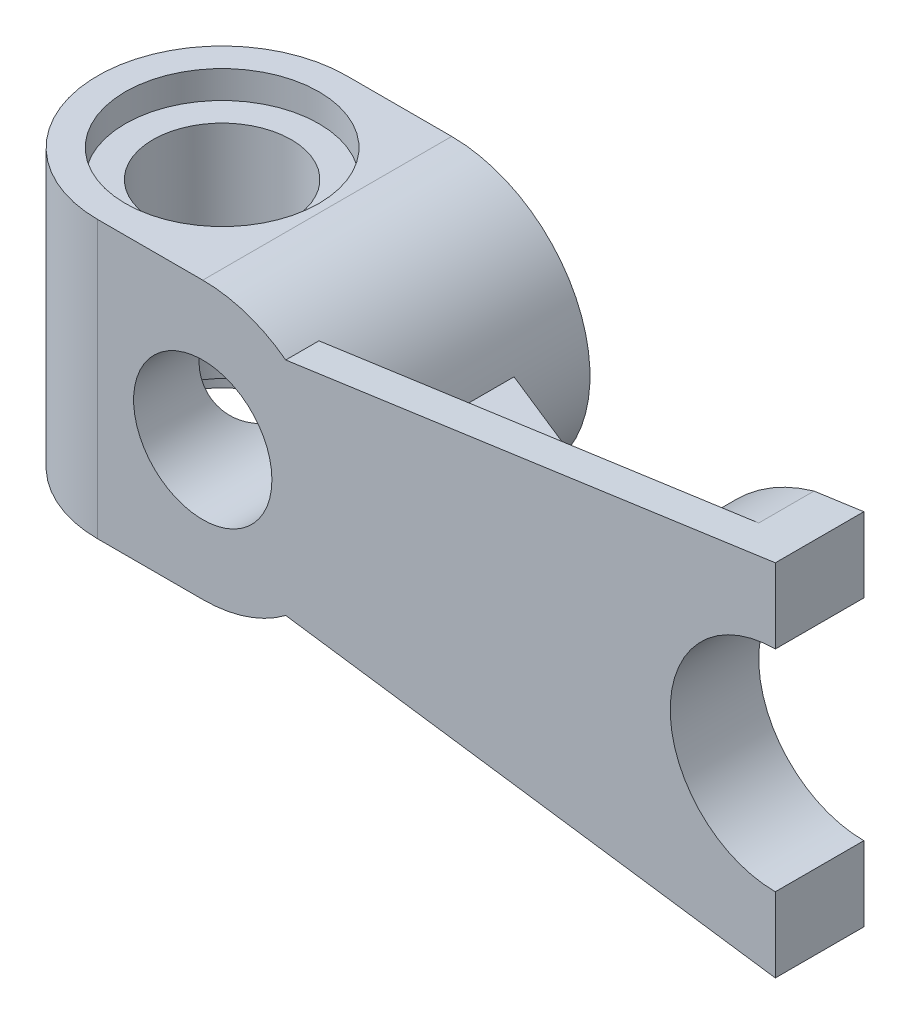
ISO-10303-21;
HEADER;
FILE_DESCRIPTION(('STEP AP214'),'2;1');
FILE_NAME('part.step','',(''),(''),'','','');
FILE_SCHEMA(('AUTOMOTIVE_DESIGN { 1 0 10303 214 1 1 1 1 }'));
ENDSEC;
DATA;
#1=APPLICATION_CONTEXT('core data for automotive mechanical design processes');
#2=APPLICATION_PROTOCOL_DEFINITION('international standard','automotive_design',2000,#1);
#3=PRODUCT_CONTEXT('',#1,'mechanical');
#4=PRODUCT('Part','Part','',(#3));
#5=PRODUCT_RELATED_PRODUCT_CATEGORY('part','',(#4));
#6=PRODUCT_DEFINITION_FORMATION('','',#4);
#7=PRODUCT_DEFINITION_CONTEXT('part definition',#1,'design');
#8=PRODUCT_DEFINITION('design','',#6,#7);
#9=PRODUCT_DEFINITION_SHAPE('','',#8);
#10=(LENGTH_UNIT() NAMED_UNIT(*) SI_UNIT(.MILLI.,.METRE.));
#11=(NAMED_UNIT(*) PLANE_ANGLE_UNIT() SI_UNIT($,.RADIAN.));
#12=(NAMED_UNIT(*) SI_UNIT($,.STERADIAN.) SOLID_ANGLE_UNIT());
#13=UNCERTAINTY_MEASURE_WITH_UNIT(LENGTH_MEASURE(1.E-05),#10,'distance_accuracy_value','');
#14=(GEOMETRIC_REPRESENTATION_CONTEXT(3) GLOBAL_UNCERTAINTY_ASSIGNED_CONTEXT((#13)) GLOBAL_UNIT_ASSIGNED_CONTEXT((#10,
#11,#12)) REPRESENTATION_CONTEXT('',''));
#15=CARTESIAN_POINT('',(0.,0.,0.));
#16=DIRECTION('',(0.,0.,1.));
#17=DIRECTION('',(1.,0.,0.));
#18=AXIS2_PLACEMENT_3D('',#15,#16,#17);
#19=CARTESIAN_POINT('',(-16.928555800193,6.71852058320159,45.));
#20=DIRECTION('',(0.,0.,-1.));
#21=DIRECTION('',(-1.,0.,0.));
#22=AXIS2_PLACEMENT_3D('',#19,#20,#21);
#23=CYLINDRICAL_SURFACE('',#22,25.);
#24=DIRECTION('',(0.,0.,1.));
#25=VECTOR('',#24,1.);
#26=CARTESIAN_POINT('',(7.34076639883021,12.7185205832016,13.));
#27=LINE('',#26,#25);
#28=CARTESIAN_POINT('',(7.34076639883021,12.7185205832016,13.));
#29=VERTEX_POINT('',#28);
#30=CARTESIAN_POINT('',(7.34076639883021,12.7185205832016,39.));
#31=VERTEX_POINT('',#30);
#32=EDGE_CURVE('E299',#29,#31,#27,.T.);
#33=ORIENTED_EDGE('',*,*,#32,.F.);
#34=CARTESIAN_POINT('',(-16.928555800193,6.71852058320159,13.));
#35=DIRECTION('',(0.,0.,1.));
#36=DIRECTION('',(-1.,0.,0.));
#37=AXIS2_PLACEMENT_3D('',#34,#35,#36);
#38=CIRCLE('',#37,25.);
#39=CARTESIAN_POINT('',(7.34076639883021,0.718520583201593,13.));
#40=VERTEX_POINT('',#39);
#41=EDGE_CURVE('E300',#40,#29,#38,.T.);
#42=ORIENTED_EDGE('',*,*,#41,.F.);
#43=DIRECTION('',(0.,0.,1.));
#44=VECTOR('',#43,1.);
#45=CARTESIAN_POINT('',(7.34076639883021,0.718520583201592,13.));
#46=LINE('',#45,#44);
#47=CARTESIAN_POINT('',(7.34076639883021,0.718520583201592,39.));
#48=VERTEX_POINT('',#47);
#49=EDGE_CURVE('E460',#40,#48,#46,.T.);
#50=ORIENTED_EDGE('',*,*,#49,.T.);
#51=CARTESIAN_POINT('',(-16.928555800193,6.71852058320159,39.));
#52=DIRECTION('',(0.,0.,1.));
#53=DIRECTION('',(1.,0.,0.));
#54=AXIS2_PLACEMENT_3D('',#51,#52,#53);
#55=CIRCLE('',#54,25.);
#56=CARTESIAN_POINT('',(-1.92855580019299,-13.2814794167984,39.));
#57=VERTEX_POINT('',#56);
#58=EDGE_CURVE('E218',#57,#48,#55,.T.);
#59=ORIENTED_EDGE('',*,*,#58,.F.);
#60=DIRECTION('',(0.,0.,1.));
#61=VECTOR('',#60,1.);
#62=CARTESIAN_POINT('',(-1.92855580019299,-13.2814794167984,39.));
#63=LINE('',#62,#61);
#64=CARTESIAN_POINT('',(-1.92855580019299,-13.2814794167984,45.));
#65=VERTEX_POINT('',#64);
#66=EDGE_CURVE('E228',#57,#65,#63,.T.);
#67=ORIENTED_EDGE('',*,*,#66,.T.);
#68=CARTESIAN_POINT('',(-16.928555800193,6.71852058320159,45.));
#69=DIRECTION('',(0.,0.,1.));
#70=DIRECTION('',(1.,0.,0.));
#71=AXIS2_PLACEMENT_3D('',#68,#69,#70);
#72=CIRCLE('',#71,25.);
#73=CARTESIAN_POINT('',(-16.928555800193,-18.2814794167984,45.));
#74=VERTEX_POINT('',#73);
#75=EDGE_CURVE('E168',#74,#65,#72,.T.);
#76=ORIENTED_EDGE('',*,*,#75,.F.);
#77=DIRECTION('',(0.,0.,-1.));
#78=VECTOR('',#77,1.);
#79=CARTESIAN_POINT('',(-16.928555800193,-18.2814794167984,45.));
#80=LINE('',#79,#78);
#81=CARTESIAN_POINT('',(-16.928555800193,-18.2814794167984,0.));
#82=VERTEX_POINT('',#81);
#83=EDGE_CURVE('E344',#74,#82,#80,.T.);
#84=ORIENTED_EDGE('',*,*,#83,.T.);
#85=CARTESIAN_POINT('',(-16.928555800193,6.71852058320159,0.));
#86=DIRECTION('',(0.,0.,1.));
#87=DIRECTION('',(1.,0.,0.));
#88=AXIS2_PLACEMENT_3D('',#85,#86,#87);
#89=CIRCLE('',#88,25.);
#90=CARTESIAN_POINT('',(-16.928555800193,31.7185205832016,0.));
#91=VERTEX_POINT('',#90);
#92=EDGE_CURVE('E366',#82,#91,#89,.T.);
#93=ORIENTED_EDGE('',*,*,#92,.T.);
#94=DIRECTION('',(0.,0.,-1.));
#95=VECTOR('',#94,1.);
#96=CARTESIAN_POINT('',(-16.928555800193,31.7185205832016,45.));
#97=LINE('',#96,#95);
#98=CARTESIAN_POINT('',(-16.928555800193,31.7185205832016,45.));
#99=VERTEX_POINT('',#98);
#100=EDGE_CURVE('E341',#99,#91,#97,.T.);
#101=ORIENTED_EDGE('',*,*,#100,.F.);
#102=CARTESIAN_POINT('',(-1.92855580019299,26.7185205832016,45.));
#103=VERTEX_POINT('',#102);
#104=EDGE_CURVE('E357',#103,#99,#72,.T.);
#105=ORIENTED_EDGE('',*,*,#104,.F.);
#106=DIRECTION('',(0.,0.,1.));
#107=VECTOR('',#106,1.);
#108=CARTESIAN_POINT('',(-1.92855580019298,26.7185205832016,39.));
#109=LINE('',#108,#107);
#110=CARTESIAN_POINT('',(-1.92855580019298,26.7185205832016,39.));
#111=VERTEX_POINT('',#110);
#112=EDGE_CURVE('E225',#111,#103,#109,.T.);
#113=ORIENTED_EDGE('',*,*,#112,.F.);
#114=EDGE_CURVE('E217',#31,#111,#55,.T.);
#115=ORIENTED_EDGE('',*,*,#114,.F.);
#116=EDGE_LOOP('',(#33,#42,#50,#59,#67,#76,#84,#93,#101,#105,#113,#115));
#117=FACE_BOUND('',#116,.T.);
#118=ADVANCED_FACE('F41',(#117),#23,.T.);
#119=CARTESIAN_POINT('',(0.,0.,39.));
#120=DIRECTION('',(0.,0.,1.));
#121=DIRECTION('',(1.,0.,0.));
#122=AXIS2_PLACEMENT_3D('',#119,#120,#121);
#123=PLANE('',#122);
#124=DIRECTION('',(1.,0.,0.));
#125=VECTOR('',#124,1.);
#126=CARTESIAN_POINT('',(7.34076639883021,12.7185205832016,39.));
#127=LINE('',#126,#125);
#128=CARTESIAN_POINT('',(54.6300916924381,12.7185205832016,39.));
#129=VERTEX_POINT('',#128);
#130=EDGE_CURVE('E440',#31,#129,#127,.T.);
#131=ORIENTED_EDGE('',*,*,#130,.F.);
#132=ORIENTED_EDGE('',*,*,#114,.T.);
#133=DIRECTION('',(0.990172022130765,0.139854805385701,0.));
#134=VECTOR('',#133,1.);
#135=CARTESIAN_POINT('',(-3.73771048869586,26.4629902599667,39.));
#136=LINE('',#135,#134);
#137=CARTESIAN_POINT('',(77.5702236953318,37.9471617548859,39.));
#138=VERTEX_POINT('',#137);
#139=EDGE_CURVE('E213',#111,#138,#136,.T.);
#140=ORIENTED_EDGE('',*,*,#139,.T.);
#141=CARTESIAN_POINT('',(86.571444199807,6.71852058320159,39.));
#142=DIRECTION('',(0.,0.,1.));
#143=DIRECTION('',(1.,0.,0.));
#144=AXIS2_PLACEMENT_3D('',#141,#142,#143);
#145=CIRCLE('',#144,32.5);
#146=EDGE_CURVE('E209',#138,#129,#145,.T.);
#147=ORIENTED_EDGE('',*,*,#146,.T.);
#148=EDGE_LOOP('',(#131,#132,#140,#147));
#149=FACE_BOUND('',#148,.T.);
#150=ADVANCED_FACE('F287',(#149),#123,.F.);
#151=DIRECTION('',(-1.,0.,0.));
#152=VECTOR('',#151,1.);
#153=CARTESIAN_POINT('',(7.34076639883021,0.718520583201592,39.));
#154=LINE('',#153,#152);
#155=CARTESIAN_POINT('',(54.6300916924381,0.718520583201587,39.));
#156=VERTEX_POINT('',#155);
#157=EDGE_CURVE('E434',#156,#48,#154,.T.);
#158=ORIENTED_EDGE('',*,*,#157,.F.);
#159=CARTESIAN_POINT('',(77.5702236953319,-24.5101205884827,39.));
#160=VERTEX_POINT('',#159);
#161=EDGE_CURVE('E171',#156,#160,#145,.T.);
#162=ORIENTED_EDGE('',*,*,#161,.T.);
#163=DIRECTION('',(0.990172022130765,-0.139854805385701,0.));
#164=VECTOR('',#163,1.);
#165=CARTESIAN_POINT('',(-1.87694478921117,-13.288769107615,39.));
#166=LINE('',#165,#164);
#167=EDGE_CURVE('E222',#57,#160,#166,.T.);
#168=ORIENTED_EDGE('',*,*,#167,.F.);
#169=ORIENTED_EDGE('',*,*,#58,.T.);
#170=EDGE_LOOP('',(#158,#162,#168,#169));
#171=FACE_BOUND('',#170,.T.);
#172=ADVANCED_FACE('F292',(#171),#123,.F.);
#173=CARTESIAN_POINT('',(86.571444199807,6.71852058320159,29.));
#174=DIRECTION('',(0.,0.,1.));
#175=DIRECTION('',(1.,0.,0.));
#176=AXIS2_PLACEMENT_3D('',#173,#174,#175);
#177=CYLINDRICAL_SURFACE('',#176,32.5);
#178=DIRECTION('',(0.,0.,1.));
#179=VECTOR('',#178,1.);
#180=CARTESIAN_POINT('',(77.5702236953318,37.9471617548859,0.));
#181=LINE('',#180,#179);
#182=CARTESIAN_POINT('',(77.5702236953318,37.9471617548859,29.));
#183=VERTEX_POINT('',#182);
#184=EDGE_CURVE('E441',#183,#138,#181,.T.);
#185=ORIENTED_EDGE('',*,*,#184,.F.);
#186=CARTESIAN_POINT('',(86.571444199807,6.71852058320159,29.));
#187=DIRECTION('',(0.,0.,1.));
#188=DIRECTION('',(1.,0.,0.));
#189=AXIS2_PLACEMENT_3D('',#186,#187,#188);
#190=CIRCLE('',#189,32.5);
#191=CARTESIAN_POINT('',(54.6300916924381,12.7185205832016,29.));
#192=VERTEX_POINT('',#191);
#193=EDGE_CURVE('E320',#183,#192,#190,.T.);
#194=ORIENTED_EDGE('',*,*,#193,.T.);
#195=DIRECTION('',(0.,0.,1.));
#196=VECTOR('',#195,1.);
#197=CARTESIAN_POINT('',(54.6300916924381,12.7185205832016,13.));
#198=LINE('',#197,#196);
#199=CARTESIAN_POINT('',(54.6300916924381,12.7185205832016,32.));
#200=VERTEX_POINT('',#199);
#201=EDGE_CURVE('E307',#192,#200,#198,.T.);
#202=ORIENTED_EDGE('',*,*,#201,.T.);
#203=EDGE_CURVE('E312',#200,#129,#198,.T.);
#204=ORIENTED_EDGE('',*,*,#203,.T.);
#205=ORIENTED_EDGE('',*,*,#146,.F.);
#206=EDGE_LOOP('',(#185,#194,#202,#204,#205));
#207=FACE_BOUND('',#206,.T.);
#208=ADVANCED_FACE('F447',(#207),#177,.T.);
#209=DIRECTION('',(0.,0.,1.));
#210=VECTOR('',#209,1.);
#211=CARTESIAN_POINT('',(77.5702236953319,-24.5101205884827,0.));
#212=LINE('',#211,#210);
#213=CARTESIAN_POINT('',(77.5702236953319,-24.5101205884827,29.));
#214=VERTEX_POINT('',#213);
#215=EDGE_CURVE('E56',#214,#160,#212,.T.);
#216=ORIENTED_EDGE('',*,*,#215,.T.);
#217=ORIENTED_EDGE('',*,*,#161,.F.);
#218=DIRECTION('',(0.,0.,1.));
#219=VECTOR('',#218,1.);
#220=CARTESIAN_POINT('',(54.6300916924381,0.718520583201565,13.));
#221=LINE('',#220,#219);
#222=CARTESIAN_POINT('',(54.6300916924381,0.718520583201576,32.));
#223=VERTEX_POINT('',#222);
#224=EDGE_CURVE('E462',#223,#156,#221,.T.);
#225=ORIENTED_EDGE('',*,*,#224,.F.);
#226=CARTESIAN_POINT('',(54.6300916924381,0.718520583201593,29.));
#227=VERTEX_POINT('',#226);
#228=EDGE_CURVE('E63',#227,#223,#221,.T.);
#229=ORIENTED_EDGE('',*,*,#228,.F.);
#230=EDGE_CURVE('E319',#227,#214,#190,.T.);
#231=ORIENTED_EDGE('',*,*,#230,.T.);
#232=EDGE_LOOP('',(#216,#217,#225,#229,#231));
#233=FACE_BOUND('',#232,.T.);
#234=ADVANCED_FACE('F470',(#233),#177,.T.);
#235=CARTESIAN_POINT('',(-16.928555800193,6.71852058320159,45.));
#236=DIRECTION('',(0.,0.,1.));
#237=DIRECTION('',(1.,0.,0.));
#238=AXIS2_PLACEMENT_3D('',#235,#236,#237);
#239=PLANE('',#238);
#240=DIRECTION('',(0.990172022130765,-0.139854805385701,0.));
#241=VECTOR('',#240,1.);
#242=CARTESIAN_POINT('',(-1.87694478921117,-13.288769107615,45.));
#243=LINE('',#242,#241);
#244=CARTESIAN_POINT('',(86.571444199807,-25.7814794167984,45.));
#245=VERTEX_POINT('',#244);
#246=EDGE_CURVE('E160',#65,#245,#243,.T.);
#247=ORIENTED_EDGE('',*,*,#246,.T.);
#248=DIRECTION('',(0.,1.,0.));
#249=VECTOR('',#248,1.);
#250=CARTESIAN_POINT('',(86.571444199807,-12.2814794167984,45.));
#251=LINE('',#250,#249);
#252=CARTESIAN_POINT('',(86.571444199807,-12.2814794167984,45.));
#253=VERTEX_POINT('',#252);
#254=EDGE_CURVE('E166',#245,#253,#251,.T.);
#255=ORIENTED_EDGE('',*,*,#254,.T.);
#256=CARTESIAN_POINT('',(86.571444199807,6.71852058320159,45.));
#257=DIRECTION('',(0.,0.,-1.));
#258=DIRECTION('',(1.,0.,0.));
#259=AXIS2_PLACEMENT_3D('',#256,#257,#258);
#260=CIRCLE('',#259,19.);
#261=CARTESIAN_POINT('',(86.571444199807,25.7185205832016,45.));
#262=VERTEX_POINT('',#261);
#263=EDGE_CURVE('E196',#253,#262,#260,.T.);
#264=ORIENTED_EDGE('',*,*,#263,.T.);
#265=DIRECTION('',(0.,1.,0.));
#266=VECTOR('',#265,1.);
#267=CARTESIAN_POINT('',(86.571444199807,39.2185205832016,45.));
#268=LINE('',#267,#266);
#269=CARTESIAN_POINT('',(86.571444199807,39.2185205832016,45.));
#270=VERTEX_POINT('',#269);
#271=EDGE_CURVE('E188',#262,#270,#268,.T.);
#272=ORIENTED_EDGE('',*,*,#271,.T.);
#273=DIRECTION('',(0.990172022130765,0.139854805385701,0.));
#274=VECTOR('',#273,1.);
#275=CARTESIAN_POINT('',(-3.73771048869586,26.4629902599667,45.));
#276=LINE('',#275,#274);
#277=EDGE_CURVE('E172',#103,#270,#276,.T.);
#278=ORIENTED_EDGE('',*,*,#277,.F.);
#279=ORIENTED_EDGE('',*,*,#104,.T.);
#280=DIRECTION('',(-1.,0.,0.));
#281=VECTOR('',#280,1.);
#282=CARTESIAN_POINT('',(-16.928555800193,31.7185205832016,45.));
#283=LINE('',#282,#281);
#284=CARTESIAN_POINT('',(-35.928555800193,31.7185205832016,45.));
#285=VERTEX_POINT('',#284);
#286=EDGE_CURVE('E377',#99,#285,#283,.T.);
#287=ORIENTED_EDGE('',*,*,#286,.T.);
#288=DIRECTION('',(0.,-1.,0.));
#289=VECTOR('',#288,1.);
#290=CARTESIAN_POINT('',(-35.928555800193,31.7185205832016,45.));
#291=LINE('',#290,#289);
#292=CARTESIAN_POINT('',(-35.928555800193,-18.2814794167984,45.));
#293=VERTEX_POINT('',#292);
#294=EDGE_CURVE('E373',#285,#293,#291,.T.);
#295=ORIENTED_EDGE('',*,*,#294,.T.);
#296=DIRECTION('',(1.,0.,0.));
#297=VECTOR('',#296,1.);
#298=CARTESIAN_POINT('',(-16.928555800193,-18.2814794167984,45.));
#299=LINE('',#298,#297);
#300=EDGE_CURVE('E353',#293,#74,#299,.T.);
#301=ORIENTED_EDGE('',*,*,#300,.T.);
#302=ORIENTED_EDGE('',*,*,#75,.T.);
#303=EDGE_LOOP('',(#247,#255,#264,#272,#278,#279,#287,#295,#301,#302));
#304=FACE_BOUND('',#303,.T.);
#305=CARTESIAN_POINT('',(-16.928555800193,6.71852058320159,45.));
#306=DIRECTION('',(0.,0.,1.));
#307=DIRECTION('',(1.,0.,0.));
#308=AXIS2_PLACEMENT_3D('',#305,#306,#307);
#309=CIRCLE('',#308,12.5);
#310=CARTESIAN_POINT('',(-4.42855580019299,6.71852058320159,45.));
#311=VERTEX_POINT('',#310);
#312=EDGE_CURVE('E370',#311,#311,#309,.T.);
#313=ORIENTED_EDGE('',*,*,#312,.F.);
#314=EDGE_LOOP('',(#313));
#315=FACE_BOUND('',#314,.T.);
#316=ADVANCED_FACE('F162',(#304,#315),#239,.T.);
#317=CARTESIAN_POINT('',(-16.928555800193,6.71852058320159,0.));
#318=DIRECTION('',(0.,0.,1.));
#319=DIRECTION('',(1.,0.,0.));
#320=AXIS2_PLACEMENT_3D('',#317,#318,#319);
#321=PLANE('',#320);
#322=ORIENTED_EDGE('',*,*,#92,.F.);
#323=DIRECTION('',(1.,0.,0.));
#324=VECTOR('',#323,1.);
#325=CARTESIAN_POINT('',(-16.928555800193,-18.2814794167984,0.));
#326=LINE('',#325,#324);
#327=CARTESIAN_POINT('',(-35.928555800193,-18.2814794167984,0.));
#328=VERTEX_POINT('',#327);
#329=EDGE_CURVE('E354',#328,#82,#326,.T.);
#330=ORIENTED_EDGE('',*,*,#329,.F.);
#331=DIRECTION('',(0.,-1.,0.));
#332=VECTOR('',#331,1.);
#333=CARTESIAN_POINT('',(-35.928555800193,31.7185205832016,0.));
#334=LINE('',#333,#332);
#335=CARTESIAN_POINT('',(-35.928555800193,31.7185205832016,0.));
#336=VERTEX_POINT('',#335);
#337=EDGE_CURVE('E358',#336,#328,#334,.T.);
#338=ORIENTED_EDGE('',*,*,#337,.F.);
#339=DIRECTION('',(-1.,0.,0.));
#340=VECTOR('',#339,1.);
#341=CARTESIAN_POINT('',(-16.928555800193,31.7185205832016,0.));
#342=LINE('',#341,#340);
#343=EDGE_CURVE('E362',#91,#336,#342,.T.);
#344=ORIENTED_EDGE('',*,*,#343,.F.);
#345=EDGE_LOOP('',(#322,#330,#338,#344));
#346=FACE_BOUND('',#345,.T.);
#347=CARTESIAN_POINT('',(-16.928555800193,6.71852058320159,0.));
#348=DIRECTION('',(0.,0.,1.));
#349=DIRECTION('',(1.,0.,0.));
#350=AXIS2_PLACEMENT_3D('',#347,#348,#349);
#351=CIRCLE('',#350,12.5);
#352=CARTESIAN_POINT('',(-4.42855580019299,6.71852058320159,0.));
#353=VERTEX_POINT('',#352);
#354=EDGE_CURVE('E383',#353,#353,#351,.T.);
#355=ORIENTED_EDGE('',*,*,#354,.T.);
#356=EDGE_LOOP('',(#355));
#357=FACE_BOUND('',#356,.T.);
#358=ADVANCED_FACE('F422',(#346,#357),#321,.F.);
#359=CARTESIAN_POINT('',(-16.928555800193,31.7185205832016,45.));
#360=DIRECTION('',(0.,-1.,0.));
#361=DIRECTION('',(0.,0.,-1.));
#362=AXIS2_PLACEMENT_3D('',#359,#360,#361);
#363=PLANE('',#362);
#364=CARTESIAN_POINT('',(-35.928555800193,31.7185205832016,22.5));
#365=DIRECTION('',(0.,1.,0.));
#366=DIRECTION('',(0.,0.,1.));
#367=AXIS2_PLACEMENT_3D('',#364,#365,#366);
#368=CIRCLE('',#367,17.5);
#369=CARTESIAN_POINT('',(-35.928555800193,31.7185205832016,40.));
#370=VERTEX_POINT('',#369);
#371=EDGE_CURVE('E398',#370,#370,#368,.T.);
#372=ORIENTED_EDGE('',*,*,#371,.F.);
#373=EDGE_LOOP('',(#372));
#374=FACE_BOUND('',#373,.T.);
#375=ORIENTED_EDGE('',*,*,#343,.T.);
#376=CARTESIAN_POINT('',(-35.928555800193,31.7185205832016,22.5));
#377=DIRECTION('',(0.,1.,0.));
#378=DIRECTION('',(0.,0.,1.));
#379=AXIS2_PLACEMENT_3D('',#376,#377,#378);
#380=CIRCLE('',#379,22.5);
#381=EDGE_CURVE('E391',#336,#285,#380,.T.);
#382=ORIENTED_EDGE('',*,*,#381,.T.);
#383=ORIENTED_EDGE('',*,*,#286,.F.);
#384=ORIENTED_EDGE('',*,*,#100,.T.);
#385=EDGE_LOOP('',(#375,#382,#383,#384));
#386=FACE_BOUND('',#385,.T.);
#387=ADVANCED_FACE('F417',(#374,#386),#363,.F.);
#388=CARTESIAN_POINT('',(-16.928555800193,-18.2814794167984,45.));
#389=DIRECTION('',(0.,1.,0.));
#390=DIRECTION('',(0.,0.,1.));
#391=AXIS2_PLACEMENT_3D('',#388,#389,#390);
#392=PLANE('',#391);
#393=CARTESIAN_POINT('',(-35.928555800193,-18.2814794167984,22.5));
#394=DIRECTION('',(0.,-1.,0.));
#395=DIRECTION('',(0.,0.,-1.));
#396=AXIS2_PLACEMENT_3D('',#393,#394,#395);
#397=CIRCLE('',#396,17.5);
#398=CARTESIAN_POINT('',(-35.928555800193,-18.2814794167984,5.));
#399=VERTEX_POINT('',#398);
#400=EDGE_CURVE('E248',#399,#399,#397,.T.);
#401=ORIENTED_EDGE('',*,*,#400,.F.);
#402=EDGE_LOOP('',(#401));
#403=FACE_BOUND('',#402,.T.);
#404=ORIENTED_EDGE('',*,*,#329,.T.);
#405=ORIENTED_EDGE('',*,*,#83,.F.);
#406=ORIENTED_EDGE('',*,*,#300,.F.);
#407=CARTESIAN_POINT('',(-35.928555800193,-18.2814794167984,22.5));
#408=DIRECTION('',(0.,1.,0.));
#409=DIRECTION('',(0.,0.,1.));
#410=AXIS2_PLACEMENT_3D('',#407,#408,#409);
#411=CIRCLE('',#410,22.5);
#412=EDGE_CURVE('E387',#328,#293,#411,.T.);
#413=ORIENTED_EDGE('',*,*,#412,.F.);
#414=EDGE_LOOP('',(#404,#405,#406,#413));
#415=FACE_BOUND('',#414,.T.);
#416=ADVANCED_FACE('F284',(#403,#415),#392,.F.);
#417=CARTESIAN_POINT('',(-16.928555800193,6.71852058320159,45.));
#418=DIRECTION('',(0.,0.,-1.));
#419=DIRECTION('',(-1.,0.,0.));
#420=AXIS2_PLACEMENT_3D('',#417,#418,#419);
#421=CYLINDRICAL_SURFACE('',#420,12.5);
#422=CARTESIAN_POINT('',(-29.428555800193,6.71852058320159,33.1770782520313));
#423=CARTESIAN_POINT('',(-29.4285548502877,6.43032693334936,33.1770789223446));
#424=CARTESIAN_POINT('',(-29.4185783373116,6.14211542096804,33.1710236357174));
#425=CARTESIAN_POINT('',(-29.3787807814926,5.56748436041855,33.1466419286941));
#426=CARTESIAN_POINT('',(-29.3489522218509,5.28106553251546,33.1283108601671));
#427=CARTESIAN_POINT('',(-29.2697407907815,4.71154735407486,33.0788641828627));
#428=CARTESIAN_POINT('',(-29.2203244960642,4.42845453341833,33.0477267186176));
#429=CARTESIAN_POINT('',(-29.1025861850855,3.86809294641737,32.9719166056268));
#430=CARTESIAN_POINT('',(-29.0342660564707,3.59082360154115,32.9272453082627));
#431=CARTESIAN_POINT('',(-28.879522908939,3.04355084896461,32.8232668279675));
#432=CARTESIAN_POINT('',(-28.793063459202,2.77356331653116,32.7639301478776));
#433=CARTESIAN_POINT('',(-28.6034701665176,2.2435247197862,32.6294924349569));
#434=CARTESIAN_POINT('',(-28.500335890928,1.98347391350782,32.5543909930813));
#435=CARTESIAN_POINT('',(-28.2792844126258,1.47566192009617,32.3872552838004));
#436=CARTESIAN_POINT('',(-28.1613808120284,1.22788971405445,32.2952365607103));
#437=CARTESIAN_POINT('',(-27.9129915960362,0.746458827765566,32.0930367921279));
#438=CARTESIAN_POINT('',(-27.782506774196,0.512799258880513,31.9828568918327));
#439=CARTESIAN_POINT('',(-27.517112766769,0.0704890899466913,31.7481203895829));
#440=CARTESIAN_POINT('',(-27.3825857612119,-0.138786479595706,31.6243095674551));
#441=CARTESIAN_POINT('',(-27.1073377440516,-0.541079695916733,31.3584815863528));
#442=CARTESIAN_POINT('',(-26.9666169030143,-0.734097789967804,31.2164649285248));
#443=CARTESIAN_POINT('',(-26.6821759019789,-1.102673766432,30.9141254483601));
#444=CARTESIAN_POINT('',(-26.5384567209546,-1.27823724318038,30.7538085270132));
#445=CARTESIAN_POINT('',(-26.2512823039307,-1.61125272284681,30.4151525738792));
#446=CARTESIAN_POINT('',(-26.107827056083,-1.7687055592917,30.2368143722167));
#447=CARTESIAN_POINT('',(-25.8344782324781,-2.0547855611648,29.8761192345308));
#448=CARTESIAN_POINT('',(-25.7043421680095,-2.1846629510694,29.6949346295152));
#449=CARTESIAN_POINT('',(-25.4496395802491,-2.42873308199787,29.3186450105255));
#450=CARTESIAN_POINT('',(-25.3250727715653,-2.54292662735005,29.1235407111874));
#451=CARTESIAN_POINT('',(-25.083749827448,-2.75611672317241,28.7205590594081));
#452=CARTESIAN_POINT('',(-24.9669953921585,-2.85510997175405,28.5126789454307));
#453=CARTESIAN_POINT('',(-24.7433029783088,-3.03856196919925,28.0855391832165));
#454=CARTESIAN_POINT('',(-24.636365385396,-3.12302014717732,27.866279088455));
#455=CARTESIAN_POINT('',(-24.4316345218949,-3.28002150089496,27.4126518189928));
#456=CARTESIAN_POINT('',(-24.3341099871998,-3.35224387931349,27.1780525152141));
#457=CARTESIAN_POINT('',(-24.1525314172997,-3.48327911655221,26.7000735721619));
#458=CARTESIAN_POINT('',(-24.0684774816589,-3.54209187626034,26.4566938680069));
#459=CARTESIAN_POINT('',(-23.9149480085212,-3.64723978171544,25.9626801970946));
#460=CARTESIAN_POINT('',(-23.8454764446583,-3.69357152741157,25.7120442741658));
#461=CARTESIAN_POINT('',(-23.721989048836,-3.77455882248088,25.2051418817064));
#462=CARTESIAN_POINT('',(-23.6679739526456,-3.80921381602354,24.9488751447592));
#463=CARTESIAN_POINT('',(-23.5722271776896,-3.86992216418207,24.4109624190643));
#464=CARTESIAN_POINT('',(-23.531872730742,-3.8950325738247,24.1289638413436));
#465=CARTESIAN_POINT('',(-23.4704918030014,-3.93297564410772,23.5620486548426));
#466=CARTESIAN_POINT('',(-23.4494662914122,-3.94580768907986,23.2771319004614));
#467=CARTESIAN_POINT('',(-23.4269891199097,-3.95951949370775,22.706136309739));
#468=CARTESIAN_POINT('',(-23.4255445616292,-3.96039491692914,22.4200570894196));
#469=CARTESIAN_POINT('',(-23.4422641483089,-3.95020455265874,21.8486830049098));
#470=CARTESIAN_POINT('',(-23.4604286329684,-3.93913855829856,21.5633881543933));
#471=CARTESIAN_POINT('',(-23.5174577774621,-3.90398173357756,20.9821607477052));
#472=CARTESIAN_POINT('',(-23.5572495954118,-3.87930672997023,20.6863536702801));
#473=CARTESIAN_POINT('',(-23.6575536551255,-3.81590408441428,20.0997835897839));
#474=CARTESIAN_POINT('',(-23.7180667326178,-3.77717587566901,19.8090207906555));
#475=CARTESIAN_POINT('',(-23.8589331812766,-3.68469835290102,19.234791116958));
#476=CARTESIAN_POINT('',(-23.9392850352381,-3.63095018751425,18.9513236862926));
#477=CARTESIAN_POINT('',(-24.1185558473881,-3.50721916401193,18.3939579449933));
#478=CARTESIAN_POINT('',(-24.2174739948454,-3.43723701475155,18.1200592171436));
#479=CARTESIAN_POINT('',(-24.4295361552515,-3.28158726797251,17.5906329834314));
#480=CARTESIAN_POINT('',(-24.5422786002939,-3.19633961220033,17.3348214694289));
#481=CARTESIAN_POINT('',(-24.7816675327472,-3.00782665749152,16.8366766017897));
#482=CARTESIAN_POINT('',(-24.9083138294246,-2.90456160570642,16.5943430633304));
#483=CARTESIAN_POINT('',(-25.1727673207586,-2.67898639066751,16.1254086542245));
#484=CARTESIAN_POINT('',(-25.3105652912126,-2.55669189205296,15.8987950631246));
#485=CARTESIAN_POINT('',(-25.5942753817494,-2.29218867122137,15.4629373419644));
#486=CARTESIAN_POINT('',(-25.7401867587845,-2.14998177083053,15.2536916256682));
#487=CARTESIAN_POINT('',(-26.0244575412717,-1.85776355001149,14.8703827002177));
#488=CARTESIAN_POINT('',(-26.1624596751779,-1.70933968580536,14.6948417526554));
#489=CARTESIAN_POINT('',(-26.4393766847264,-1.39554448004019,14.3604294814522));
#490=CARTESIAN_POINT('',(-26.5782915065244,-1.23017412999062,14.201557183657));
#491=CARTESIAN_POINT('',(-26.8540491392435,-0.883038972323527,13.9008744922312));
#492=CARTESIAN_POINT('',(-26.9908920521238,-0.701274974524087,13.7590632566201));
#493=CARTESIAN_POINT('',(-27.2596344676923,-0.322272641261422,13.4924674625166));
#494=CARTESIAN_POINT('',(-27.3915339727975,-0.125034313364229,13.3676828956994));
#495=CARTESIAN_POINT('',(-27.6425415544296,0.275379372802375,13.1394669956271));
#496=CARTESIAN_POINT('',(-27.7619513625724,0.477990481002103,13.0353753905542));
#497=CARTESIAN_POINT('',(-27.9917080468298,0.895005176216594,12.8418939588233));
#498=CARTESIAN_POINT('',(-28.1020552303508,1.10940836282904,12.7525036333913));
#499=CARTESIAN_POINT('',(-28.3119538313306,1.54865433033581,12.5876239360692));
#500=CARTESIAN_POINT('',(-28.4115024911166,1.77349975707868,12.5121381116211));
#501=CARTESIAN_POINT('',(-28.5983249110896,2.23211781575949,12.3742308899524));
#502=CARTESIAN_POINT('',(-28.685598054987,2.46589089515967,12.3118101485847));
#503=CARTESIAN_POINT('',(-28.8514985436875,2.95500830894285,12.1958203956442));
#504=CARTESIAN_POINT('',(-28.9293034993946,3.21080884711088,12.142998187549));
#505=CARTESIAN_POINT('',(-29.0687770038554,3.72903135026961,12.0500977407176));
#506=CARTESIAN_POINT('',(-29.1304450491512,3.99145352156964,12.0100198995865));
#507=CARTESIAN_POINT('',(-29.2368986206706,4.52130861902761,11.9417934511641));
#508=CARTESIAN_POINT('',(-29.2816788350608,4.7887430940182,11.9136485968833));
#509=CARTESIAN_POINT('',(-29.3538161497509,5.32689522790386,11.8686971013209));
#510=CARTESIAN_POINT('',(-29.3811725817572,5.59761301232528,11.8518908949344));
#511=CARTESIAN_POINT('',(-29.4195719087093,6.16145089190954,11.8283698231912));
#512=CARTESIAN_POINT('',(-29.4292105884878,6.45470403455927,11.8225229107571));
#513=CARTESIAN_POINT('',(-29.427831824777,7.04115339037647,11.8233627051288));
#514=CARTESIAN_POINT('',(-29.4168133143965,7.33434959982131,11.8300500592974));
#515=CARTESIAN_POINT('',(-29.3742479218116,7.91877404334335,11.8561439013894));
#516=CARTESIAN_POINT('',(-29.3426947949737,8.21000165153428,11.8755542584259));
#517=CARTESIAN_POINT('',(-29.2594548040365,8.78837275492169,11.9276067710544));
#518=CARTESIAN_POINT('',(-29.2077679884226,9.0755162599517,11.9602488947818));
#519=CARTESIAN_POINT('',(-29.0837528178925,9.64921613839796,12.0403523394056));
#520=CARTESIAN_POINT('',(-29.0110403529163,9.93565108152048,12.0880911344793));
#521=CARTESIAN_POINT('',(-28.8465133191509,10.4998742324432,12.1992948872472));
#522=CARTESIAN_POINT('',(-28.7546982951029,10.777662233985,12.2627602197488));
#523=CARTESIAN_POINT('',(-28.5535670983066,11.3221374887435,12.4066944344217));
#524=CARTESIAN_POINT('',(-28.4442595061918,11.5888301041809,12.487154986083));
#525=CARTESIAN_POINT('',(-28.2101749837327,12.1089161585374,12.666469811061));
#526=CARTESIAN_POINT('',(-28.0853992337433,12.3623106101244,12.7653226811719));
#527=CARTESIAN_POINT('',(-27.8299926921681,12.8404641488139,12.9769085363208));
#528=CARTESIAN_POINT('',(-27.7000272130025,13.0660295292722,13.0886224561846));
#529=CARTESIAN_POINT('',(-27.4312797653438,13.5014575938363,13.3305417241281));
#530=CARTESIAN_POINT('',(-27.2924981419942,13.7113208919637,13.460746348561));
#531=CARTESIAN_POINT('',(-27.0093042818992,14.1137228161227,13.7400649126999));
#532=CARTESIAN_POINT('',(-26.8648956041733,14.3062721459801,13.8891670302979));
#533=CARTESIAN_POINT('',(-26.5737560223369,14.6730754843008,14.2063858561484));
#534=CARTESIAN_POINT('',(-26.4270252642811,14.8473306382132,14.3745013725488));
#535=CARTESIAN_POINT('',(-26.1464835577773,15.1636895795929,14.715030294335));
#536=CARTESIAN_POINT('',(-26.0125803870853,15.3072511571018,14.8860171874797));
#537=CARTESIAN_POINT('',(-25.7484643075094,15.5782621419198,15.2429339281553));
#538=CARTESIAN_POINT('',(-25.6182511843367,15.7057124863356,15.4288629055531));
#539=CARTESIAN_POINT('',(-25.3640074171205,15.9447671308165,15.8146654438053));
#540=CARTESIAN_POINT('',(-25.2399779586964,16.056368399598,16.0145416613269));
#541=CARTESIAN_POINT('',(-25.0003895804642,16.2642350592584,16.4269402655854));
#542=CARTESIAN_POINT('',(-24.8848309173066,16.360499985576,16.6394630351378));
#543=CARTESIAN_POINT('',(-24.6638678293545,16.5386606185944,17.0762684312188));
#544=CARTESIAN_POINT('',(-24.5584895567229,16.6205197392559,17.3005791732985));
#545=CARTESIAN_POINT('',(-24.3598557833186,16.7704493172279,17.75894787753));
#546=CARTESIAN_POINT('',(-24.266600208626,16.8385198586174,17.9930057802357));
#547=CARTESIAN_POINT('',(-24.0935059464618,16.9618007330181,18.4693871129866));
#548=CARTESIAN_POINT('',(-24.0136706988727,17.0170077702669,18.7117126430914));
#549=CARTESIAN_POINT('',(-23.8684678379313,17.1154101608437,19.2030444816178));
#550=CARTESIAN_POINT('',(-23.8031009510375,17.1586049110612,19.4520511247954));
#551=CARTESIAN_POINT('',(-23.6830197052296,17.2367316155892,19.9752279177017));
#552=CARTESIAN_POINT('',(-23.6295632544744,17.2707351878944,20.2498262216116));
#553=CARTESIAN_POINT('',(-23.5410845845735,17.3264041073551,20.8032120403497));
#554=CARTESIAN_POINT('',(-23.5060632198265,17.3480688826565,21.0819997487257));
#555=CARTESIAN_POINT('',(-23.4548617532724,17.3795823054209,21.6420627669253));
#556=CARTESIAN_POINT('',(-23.4386884052739,17.3894267173322,21.9233389320827));
#557=CARTESIAN_POINT('',(-23.4253897447458,17.397528293782,22.4865094354787));
#558=CARTESIAN_POINT('',(-23.4282649079893,17.3957851688996,22.7684037889819));
#559=CARTESIAN_POINT('',(-23.453753364991,17.3802299275452,23.3473822951697));
#560=CARTESIAN_POINT('',(-23.4775021872341,17.3657234355641,23.6443988125016));
#561=CARTESIAN_POINT('',(-23.5459875500011,17.3232937979564,24.2350499469589));
#562=CARTESIAN_POINT('',(-23.5907250468184,17.2953700410063,24.5286844093653));
#563=CARTESIAN_POINT('',(-23.7005861437332,17.2253681771803,25.1104372988111));
#564=CARTESIAN_POINT('',(-23.7657114641759,17.1832888758228,25.3985552581846));
#565=CARTESIAN_POINT('',(-23.9153927087801,17.0839522261398,25.9670291509375));
#566=CARTESIAN_POINT('',(-23.9999480746365,17.0266953139219,26.2473853070859));
#567=CARTESIAN_POINT('',(-24.1861965861754,16.8964097262252,26.7953339237912));
#568=CARTESIAN_POINT('',(-24.2877112600036,16.8235432707436,27.0630254665754));
#569=CARTESIAN_POINT('',(-24.5066654659235,16.6603956749826,27.5863403214177));
#570=CARTESIAN_POINT('',(-24.624104989765,16.570114543725,27.8419636397278));
#571=CARTESIAN_POINT('',(-24.8725055395788,16.370928091405,28.3387336508235));
#572=CARTESIAN_POINT('',(-25.00345608902,16.2620371581214,28.5798913342669));
#573=CARTESIAN_POINT('',(-25.2761024908693,16.0244929997374,29.0458445117253));
#574=CARTESIAN_POINT('',(-25.4177973318513,15.8958416336412,29.2706415419743));
#575=CARTESIAN_POINT('',(-25.6975640985605,15.6285721114542,29.6857255426598));
#576=CARTESIAN_POINT('',(-25.8350984467328,15.4914454312729,29.8773367235083));
#577=CARTESIAN_POINT('',(-26.1135268808053,15.1994976437026,30.2439123759415));
#578=CARTESIAN_POINT('',(-26.2544207831481,15.0446775012928,30.4188777544147));
#579=CARTESIAN_POINT('',(-26.5364099545679,14.7176287361905,30.7513706684932));
#580=CARTESIAN_POINT('',(-26.6775051469593,14.5454055687148,30.908903636286));
#581=CARTESIAN_POINT('',(-26.9568139711157,14.184184855751,31.2062894435758));
#582=CARTESIAN_POINT('',(-27.0950276634763,13.9951876634482,31.3461426551784));
#583=CARTESIAN_POINT('',(-27.3577850988929,13.6128549432334,31.6007372232722));
#584=CARTESIAN_POINT('',(-27.4826575560967,13.4203976811551,31.7164614812947));
#585=CARTESIAN_POINT('',(-27.7249210892073,13.0227019567668,31.9327490215999));
#586=CARTESIAN_POINT('',(-27.8423124574442,12.8174639944947,32.0333128964981));
#587=CARTESIAN_POINT('',(-28.0676952846707,12.3953901710625,32.219995353204));
#588=CARTESIAN_POINT('',(-28.1756805484869,12.1785468157169,32.3061044487101));
#589=CARTESIAN_POINT('',(-28.3804788053456,11.7348119808075,32.4646026795922));
#590=CARTESIAN_POINT('',(-28.4772915184887,11.5079202497045,32.5369914712705));
#591=CARTESIAN_POINT('',(-28.6623985393476,11.0352541483927,32.6718563189972));
#592=CARTESIAN_POINT('',(-28.7501210351987,10.7890888826336,32.7337469278555));
#593=CARTESIAN_POINT('',(-28.9106350331694,10.2890588819707,32.8444816064532));
#594=CARTESIAN_POINT('',(-28.983424875226,10.0351932946191,32.8933242258301));
#595=CARTESIAN_POINT('',(-29.113050940727,9.52175167134068,32.9787840244763));
#596=CARTESIAN_POINT('',(-29.1699065463389,9.26218299088626,33.0154160668764));
#597=CARTESIAN_POINT('',(-29.2670991587469,8.73871682887492,33.0772546449682));
#598=CARTESIAN_POINT('',(-29.307441263338,8.47482070942271,33.1024647069359));
#599=CARTESIAN_POINT('',(-29.3689731856127,7.9626454021664,33.1406337161233));
#600=CARTESIAN_POINT('',(-29.3912995238927,7.7145559871712,33.1543225380739));
#601=CARTESIAN_POINT('',(-29.4210912780158,7.21715570282923,33.1725445382159));
#602=CARTESIAN_POINT('',(-29.4285566219821,6.96784482758059,33.1770776721249));
#603=CARTESIAN_POINT('',(-29.428555800193,6.71852058320159,33.1770782520313));
#604=B_SPLINE_CURVE_WITH_KNOTS('',3,(#422,#423,#424,#425,#426,#427,#428,#429,#430,#431,#432,
#433,#434,#435,#436,#437,#438,#439,#440,#441,#442,#443,#444,#445,#446,#447,#448,#449,#450,#451,
#452,#453,#454,#455,#456,#457,#458,#459,#460,#461,#462,#463,#464,#465,#466,#467,#468,#469,#470,
#471,#472,#473,#474,#475,#476,#477,#478,#479,#480,#481,#482,#483,#484,#485,#486,#487,#488,#489,
#490,#491,#492,#493,#494,#495,#496,#497,#498,#499,#500,#501,#502,#503,#504,#505,#506,#507,#508,
#509,#510,#511,#512,#513,#514,#515,#516,#517,#518,#519,#520,#521,#522,#523,#524,#525,#526,#527,
#528,#529,#530,#531,#532,#533,#534,#535,#536,#537,#538,#539,#540,#541,#542,#543,#544,#545,#546,
#547,#548,#549,#550,#551,#552,#553,#554,#555,#556,#557,#558,#559,#560,#561,#562,#563,#564,#565,
#566,#567,#568,#569,#570,#571,#572,#573,#574,#575,#576,#577,#578,#579,#580,#581,#582,#583,#584,
#585,#586,#587,#588,#589,#590,#591,#592,#593,#594,#595,#596,#597,#598,#599,#600,#601,#602,#603),
.UNSPECIFIED.,.T.,.F.,(4,2,2,2,2,2,2,2,2,2,2,2,2,2,2,2,2,2,2,2,2,2,2,2,2,2,2,2,2,2,2,2,2,2,2,2,
2,2,2,2,2,2,2,2,2,2,2,2,2,2,2,2,2,2,2,2,2,2,2,2,2,2,2,2,2,2,2,2,2,2,2,2,2,2,2,2,2,2,2,2,2,2,2,2,
2,2,2,2,2,2,4),(0.,0.864375274841502,1.72907802394559,2.59526264371872,3.46136080162739,
4.32921536503657,5.19709244926997,6.06417604100024,6.93120497757555,7.76376146431638,
8.59629503844155,9.4285609132593,10.2607884684063,11.0342691218755,11.8077100934368,
12.5813188389575,13.3549579621271,14.1464922606342,14.9380324092738,15.7297879700088,
16.5215812141472,17.3785557435524,18.2355732415751,19.0929015549396,19.950244720559,
20.8476291810983,21.7450498391476,22.6424018866338,23.5397147587124,24.4153423237027,
25.2909578783178,26.1658564210573,27.0406749697855,27.8440033802362,28.6472848161426,
29.4505265930342,30.2537679771904,31.0244678166518,31.7951415029871,32.5660115390452,
33.3369202626639,34.1536573477803,34.9704199113639,35.7874391624627,36.6044897486463,
37.4838905313519,38.363336734115,39.2430505039365,40.1227621552603,41.0196874203254,
41.9166340636794,42.8131420686748,43.7095817043739,44.5582989477806,45.4069829851797,
46.2551386898734,47.1032412574796,47.8833125500151,48.6633384489635,49.443513334801,
50.2237118488363,51.0058640813761,51.78801154441,52.5703591818791,53.3527460922261,
54.1972545623175,55.0418021688419,55.886652309095,56.7315235511755,57.6254142607352,
58.519345702012,59.4133525944759,60.3073338016688,61.1924398598554,62.077545459502,
62.9619698285599,63.8463110444427,64.6637150027075,65.4810744020333,66.2981783789929,
67.1152651555059,67.8852461174601,68.6551969732439,69.4256511691509,70.1961246626184,
71.0009305005802,71.8058257603759,72.6097376656367,73.4134012120316,74.1611923935606,
74.9089871918508),.UNSPECIFIED.);
#605=CARTESIAN_POINT('',(-29.428555800193,6.71852058320159,33.1770782520313));
#606=VERTEX_POINT('',#605);
#607=EDGE_CURVE('E239',#606,#606,#604,.T.);
#608=ORIENTED_EDGE('',*,*,#607,.F.);
#609=EDGE_LOOP('',(#608));
#610=FACE_BOUND('',#609,.T.);
#611=ORIENTED_EDGE('',*,*,#312,.T.);
#612=EDGE_LOOP('',(#611));
#613=FACE_BOUND('',#612,.T.);
#614=ORIENTED_EDGE('',*,*,#354,.F.);
#615=EDGE_LOOP('',(#614));
#616=FACE_BOUND('',#615,.T.);
#617=ADVANCED_FACE('F251',(#610,#613,#616),#421,.F.);
#618=CARTESIAN_POINT('',(-35.928555800193,-18.2814794167984,22.5));
#619=DIRECTION('',(0.,1.,0.));
#620=DIRECTION('',(0.,0.,1.));
#621=AXIS2_PLACEMENT_3D('',#618,#619,#620);
#622=CYLINDRICAL_SURFACE('',#621,22.5);
#623=ORIENTED_EDGE('',*,*,#381,.F.);
#624=ORIENTED_EDGE('',*,*,#337,.T.);
#625=ORIENTED_EDGE('',*,*,#412,.T.);
#626=ORIENTED_EDGE('',*,*,#294,.F.);
#627=EDGE_LOOP('',(#623,#624,#625,#626));
#628=FACE_BOUND('',#627,.T.);
#629=ADVANCED_FACE('F277',(#628),#622,.T.);
#630=CARTESIAN_POINT('',(-35.928555800193,26.7185205832016,22.5));
#631=DIRECTION('',(0.,1.,0.));
#632=DIRECTION('',(0.,0.,1.));
#633=AXIS2_PLACEMENT_3D('',#630,#631,#632);
#634=CYLINDRICAL_SURFACE('',#633,17.5);
#635=CARTESIAN_POINT('',(-35.928555800193,26.7185205832016,22.5));
#636=DIRECTION('',(0.,1.,0.));
#637=DIRECTION('',(0.,0.,1.));
#638=AXIS2_PLACEMENT_3D('',#635,#636,#637);
#639=CIRCLE('',#638,17.5);
#640=CARTESIAN_POINT('',(-35.928555800193,26.7185205832016,40.));
#641=VERTEX_POINT('',#640);
#642=EDGE_CURVE('E395',#641,#641,#639,.T.);
#643=ORIENTED_EDGE('',*,*,#642,.F.);
#644=EDGE_LOOP('',(#643));
#645=FACE_BOUND('',#644,.T.);
#646=ORIENTED_EDGE('',*,*,#371,.T.);
#647=EDGE_LOOP('',(#646));
#648=FACE_BOUND('',#647,.T.);
#649=ADVANCED_FACE('F274',(#645,#648),#634,.F.);
#650=CARTESIAN_POINT('',(-35.928555800193,26.7185205832016,22.5));
#651=DIRECTION('',(0.,1.,0.));
#652=DIRECTION('',(0.,0.,1.));
#653=AXIS2_PLACEMENT_3D('',#650,#651,#652);
#654=PLANE('',#653);
#655=CARTESIAN_POINT('',(-35.928555800193,26.7185205832016,22.5));
#656=DIRECTION('',(0.,1.,0.));
#657=DIRECTION('',(0.,0.,1.));
#658=AXIS2_PLACEMENT_3D('',#655,#656,#657);
#659=CIRCLE('',#658,12.5);
#660=CARTESIAN_POINT('',(-35.928555800193,26.7185205832016,35.));
#661=VERTEX_POINT('',#660);
#662=EDGE_CURVE('E238',#661,#661,#659,.T.);
#663=ORIENTED_EDGE('',*,*,#662,.F.);
#664=EDGE_LOOP('',(#663));
#665=FACE_BOUND('',#664,.T.);
#666=ORIENTED_EDGE('',*,*,#642,.T.);
#667=EDGE_LOOP('',(#666));
#668=FACE_BOUND('',#667,.T.);
#669=ADVANCED_FACE('F270',(#665,#668),#654,.T.);
#670=CARTESIAN_POINT('',(-35.928555800193,-13.2814794167984,22.5));
#671=DIRECTION('',(0.,-1.,0.));
#672=DIRECTION('',(0.,0.,-1.));
#673=AXIS2_PLACEMENT_3D('',#670,#671,#672);
#674=CYLINDRICAL_SURFACE('',#673,17.5);
#675=CARTESIAN_POINT('',(-35.928555800193,-13.2814794167984,22.5));
#676=DIRECTION('',(0.,-1.,0.));
#677=DIRECTION('',(0.,0.,-1.));
#678=AXIS2_PLACEMENT_3D('',#675,#676,#677);
#679=CIRCLE('',#678,17.5);
#680=CARTESIAN_POINT('',(-35.928555800193,-13.2814794167984,5.));
#681=VERTEX_POINT('',#680);
#682=EDGE_CURVE('E249',#681,#681,#679,.T.);
#683=ORIENTED_EDGE('',*,*,#682,.F.);
#684=EDGE_LOOP('',(#683));
#685=FACE_BOUND('',#684,.T.);
#686=ORIENTED_EDGE('',*,*,#400,.T.);
#687=EDGE_LOOP('',(#686));
#688=FACE_BOUND('',#687,.T.);
#689=ADVANCED_FACE('F266',(#685,#688),#674,.F.);
#690=CARTESIAN_POINT('',(-35.928555800193,-13.2814794167984,22.5));
#691=DIRECTION('',(0.,-1.,0.));
#692=DIRECTION('',(0.,0.,-1.));
#693=AXIS2_PLACEMENT_3D('',#690,#691,#692);
#694=PLANE('',#693);
#695=CARTESIAN_POINT('',(-35.928555800193,-13.2814794167984,22.5));
#696=DIRECTION('',(0.,-1.,0.));
#697=DIRECTION('',(0.,0.,-1.));
#698=AXIS2_PLACEMENT_3D('',#695,#696,#697);
#699=CIRCLE('',#698,12.5);
#700=CARTESIAN_POINT('',(-35.928555800193,-13.2814794167984,10.));
#701=VERTEX_POINT('',#700);
#702=EDGE_CURVE('E231',#701,#701,#699,.T.);
#703=ORIENTED_EDGE('',*,*,#702,.F.);
#704=EDGE_LOOP('',(#703));
#705=FACE_BOUND('',#704,.T.);
#706=ORIENTED_EDGE('',*,*,#682,.T.);
#707=EDGE_LOOP('',(#706));
#708=FACE_BOUND('',#707,.T.);
#709=ADVANCED_FACE('F260',(#705,#708),#694,.T.);
#710=CARTESIAN_POINT('',(-35.928555800193,82.7185205832016,22.5));
#711=DIRECTION('',(0.,-1.,0.));
#712=DIRECTION('',(0.,0.,-1.));
#713=AXIS2_PLACEMENT_3D('',#710,#711,#712);
#714=CYLINDRICAL_SURFACE('',#713,12.5);
#715=ORIENTED_EDGE('',*,*,#607,.T.);
#716=EDGE_LOOP('',(#715));
#717=FACE_BOUND('',#716,.T.);
#718=ORIENTED_EDGE('',*,*,#662,.T.);
#719=EDGE_LOOP('',(#718));
#720=FACE_BOUND('',#719,.T.);
#721=ORIENTED_EDGE('',*,*,#702,.T.);
#722=EDGE_LOOP('',(#721));
#723=FACE_BOUND('',#722,.T.);
#724=ADVANCED_FACE('F255',(#717,#720,#723),#714,.F.);
#725=CARTESIAN_POINT('',(-1.87694478921117,-13.288769107615,39.));
#726=DIRECTION('',(-0.139854805385701,-0.990172022130765,0.));
#727=DIRECTION('',(0.990172022130765,-0.139854805385701,0.));
#728=AXIS2_PLACEMENT_3D('',#725,#726,#727);
#729=PLANE('',#728);
#730=ORIENTED_EDGE('',*,*,#246,.F.);
#731=ORIENTED_EDGE('',*,*,#66,.F.);
#732=ORIENTED_EDGE('',*,*,#167,.T.);
#733=ORIENTED_EDGE('',*,*,#215,.F.);
#734=DIRECTION('',(-0.990172022130765,0.1398548053857,0.));
#735=VECTOR('',#734,1.);
#736=CARTESIAN_POINT('',(82.0708339475695,-25.1458000026406,29.));
#737=LINE('',#736,#735);
#738=CARTESIAN_POINT('',(86.571444199807,-25.7814794167984,29.));
#739=VERTEX_POINT('',#738);
#740=EDGE_CURVE('E11',#739,#214,#737,.T.);
#741=ORIENTED_EDGE('',*,*,#740,.F.);
#742=DIRECTION('',(0.,0.,1.));
#743=VECTOR('',#742,1.);
#744=CARTESIAN_POINT('',(86.571444199807,-25.7814794167984,29.));
#745=LINE('',#744,#743);
#746=EDGE_CURVE('E175',#739,#245,#745,.T.);
#747=ORIENTED_EDGE('',*,*,#746,.T.);
#748=EDGE_LOOP('',(#730,#731,#732,#733,#741,#747));
#749=FACE_BOUND('',#748,.T.);
#750=ADVANCED_FACE('F176',(#749),#729,.T.);
#751=CARTESIAN_POINT('',(-3.73771048869586,26.4629902599667,39.));
#752=DIRECTION('',(0.139854805385701,-0.990172022130765,0.));
#753=DIRECTION('',(0.990172022130765,0.139854805385701,0.));
#754=AXIS2_PLACEMENT_3D('',#751,#752,#753);
#755=PLANE('',#754);
#756=ORIENTED_EDGE('',*,*,#277,.T.);
#757=DIRECTION('',(0.,0.,1.));
#758=VECTOR('',#757,1.);
#759=CARTESIAN_POINT('',(86.571444199807,39.2185205832016,29.));
#760=LINE('',#759,#758);
#761=CARTESIAN_POINT('',(86.571444199807,39.2185205832016,29.));
#762=VERTEX_POINT('',#761);
#763=EDGE_CURVE('E182',#762,#270,#760,.T.);
#764=ORIENTED_EDGE('',*,*,#763,.F.);
#765=DIRECTION('',(0.990172022130765,0.139854805385701,0.));
#766=VECTOR('',#765,1.);
#767=CARTESIAN_POINT('',(82.0708339475694,38.5828411690437,29.));
#768=LINE('',#767,#766);
#769=EDGE_CURVE('E49',#183,#762,#768,.T.);
#770=ORIENTED_EDGE('',*,*,#769,.F.);
#771=ORIENTED_EDGE('',*,*,#184,.T.);
#772=ORIENTED_EDGE('',*,*,#139,.F.);
#773=ORIENTED_EDGE('',*,*,#112,.T.);
#774=EDGE_LOOP('',(#756,#764,#770,#771,#772,#773));
#775=FACE_BOUND('',#774,.T.);
#776=ADVANCED_FACE('F262',(#775),#755,.F.);
#777=CARTESIAN_POINT('',(86.571444199807,6.71852058320159,29.));
#778=DIRECTION('',(0.,0.,1.));
#779=DIRECTION('',(1.,0.,0.));
#780=AXIS2_PLACEMENT_3D('',#777,#778,#779);
#781=CYLINDRICAL_SURFACE('',#780,19.);
#782=ORIENTED_EDGE('',*,*,#263,.F.);
#783=DIRECTION('',(0.,0.,1.));
#784=VECTOR('',#783,1.);
#785=CARTESIAN_POINT('',(86.571444199807,-12.2814794167984,29.));
#786=LINE('',#785,#784);
#787=CARTESIAN_POINT('',(86.571444199807,-12.2814794167984,29.));
#788=VERTEX_POINT('',#787);
#789=EDGE_CURVE('E181',#788,#253,#786,.T.);
#790=ORIENTED_EDGE('',*,*,#789,.F.);
#791=CARTESIAN_POINT('',(86.571444199807,6.71852058320159,29.));
#792=DIRECTION('',(0.,0.,-1.));
#793=DIRECTION('',(1.,0.,0.));
#794=AXIS2_PLACEMENT_3D('',#791,#792,#793);
#795=CIRCLE('',#794,19.);
#796=CARTESIAN_POINT('',(86.571444199807,25.7185205832016,29.));
#797=VERTEX_POINT('',#796);
#798=EDGE_CURVE('E187',#788,#797,#795,.T.);
#799=ORIENTED_EDGE('',*,*,#798,.T.);
#800=DIRECTION('',(0.,0.,1.));
#801=VECTOR('',#800,1.);
#802=CARTESIAN_POINT('',(86.571444199807,25.7185205832016,29.));
#803=LINE('',#802,#801);
#804=EDGE_CURVE('E205',#797,#262,#803,.T.);
#805=ORIENTED_EDGE('',*,*,#804,.T.);
#806=EDGE_LOOP('',(#782,#790,#799,#805));
#807=FACE_BOUND('',#806,.T.);
#808=ADVANCED_FACE('F332',(#807),#781,.F.);
#809=CARTESIAN_POINT('',(86.571444199807,-12.2814794167984,29.));
#810=DIRECTION('',(1.,0.,0.));
#811=DIRECTION('',(0.,0.,-1.));
#812=AXIS2_PLACEMENT_3D('',#809,#810,#811);
#813=PLANE('',#812);
#814=ORIENTED_EDGE('',*,*,#254,.F.);
#815=ORIENTED_EDGE('',*,*,#746,.F.);
#816=DIRECTION('',(0.,1.,0.));
#817=VECTOR('',#816,1.);
#818=CARTESIAN_POINT('',(86.571444199807,-12.2814794167984,29.));
#819=LINE('',#818,#817);
#820=EDGE_CURVE('E208',#739,#788,#819,.T.);
#821=ORIENTED_EDGE('',*,*,#820,.T.);
#822=ORIENTED_EDGE('',*,*,#789,.T.);
#823=EDGE_LOOP('',(#814,#815,#821,#822));
#824=FACE_BOUND('',#823,.T.);
#825=ADVANCED_FACE('F184',(#824),#813,.T.);
#826=CARTESIAN_POINT('',(86.571444199807,39.2185205832016,29.));
#827=DIRECTION('',(1.,0.,0.));
#828=DIRECTION('',(0.,0.,-1.));
#829=AXIS2_PLACEMENT_3D('',#826,#827,#828);
#830=PLANE('',#829);
#831=ORIENTED_EDGE('',*,*,#271,.F.);
#832=ORIENTED_EDGE('',*,*,#804,.F.);
#833=DIRECTION('',(0.,1.,0.));
#834=VECTOR('',#833,1.);
#835=CARTESIAN_POINT('',(86.571444199807,39.2185205832016,29.));
#836=LINE('',#835,#834);
#837=EDGE_CURVE('E193',#797,#762,#836,.T.);
#838=ORIENTED_EDGE('',*,*,#837,.T.);
#839=ORIENTED_EDGE('',*,*,#763,.T.);
#840=EDGE_LOOP('',(#831,#832,#838,#839));
#841=FACE_BOUND('',#840,.T.);
#842=ADVANCED_FACE('F335',(#841),#830,.T.);
#843=CARTESIAN_POINT('',(86.571444199807,6.71852058320159,29.));
#844=DIRECTION('',(0.,0.,1.));
#845=DIRECTION('',(1.,0.,0.));
#846=AXIS2_PLACEMENT_3D('',#843,#844,#845);
#847=PLANE('',#846);
#848=ORIENTED_EDGE('',*,*,#820,.F.);
#849=ORIENTED_EDGE('',*,*,#740,.T.);
#850=ORIENTED_EDGE('',*,*,#230,.F.);
#851=DIRECTION('',(0.,1.,0.));
#852=VECTOR('',#851,1.);
#853=CARTESIAN_POINT('',(54.6300916924381,6.71852058320159,29.));
#854=LINE('',#853,#852);
#855=EDGE_CURVE('E451',#227,#192,#854,.T.);
#856=ORIENTED_EDGE('',*,*,#855,.T.);
#857=ORIENTED_EDGE('',*,*,#193,.F.);
#858=ORIENTED_EDGE('',*,*,#769,.T.);
#859=ORIENTED_EDGE('',*,*,#837,.F.);
#860=ORIENTED_EDGE('',*,*,#798,.F.);
#861=EDGE_LOOP('',(#848,#849,#850,#856,#857,#858,#859,#860));
#862=FACE_BOUND('',#861,.T.);
#863=ADVANCED_FACE('F326',(#862),#847,.F.);
#864=CARTESIAN_POINT('',(7.34076639883021,12.7185205832016,13.));
#865=DIRECTION('',(0.,-1.,0.));
#866=DIRECTION('',(1.,0.,0.));
#867=AXIS2_PLACEMENT_3D('',#864,#865,#866);
#868=PLANE('',#867);
#869=ORIENTED_EDGE('',*,*,#203,.F.);
#870=DIRECTION('',(-0.927905412713069,0.,-0.372815698513072));
#871=VECTOR('',#870,1.);
#872=CARTESIAN_POINT('',(7.34076639883021,12.7185205832016,13.));
#873=LINE('',#872,#871);
#874=EDGE_CURVE('E456',#200,#29,#873,.T.);
#875=ORIENTED_EDGE('',*,*,#874,.T.);
#876=ORIENTED_EDGE('',*,*,#32,.T.);
#877=ORIENTED_EDGE('',*,*,#130,.T.);
#878=EDGE_LOOP('',(#869,#875,#876,#877));
#879=FACE_BOUND('',#878,.T.);
#880=ADVANCED_FACE('F449',(#879),#868,.F.);
#881=CARTESIAN_POINT('',(7.34076639883021,0.718520583201592,13.));
#882=DIRECTION('',(0.,1.,0.));
#883=DIRECTION('',(-1.,0.,0.));
#884=AXIS2_PLACEMENT_3D('',#881,#882,#883);
#885=PLANE('',#884);
#886=ORIENTED_EDGE('',*,*,#49,.F.);
#887=DIRECTION('',(-0.927905412713069,0.,-0.372815698513072));
#888=VECTOR('',#887,1.);
#889=CARTESIAN_POINT('',(54.6300916924381,0.718520583201593,32.));
#890=LINE('',#889,#888);
#891=EDGE_CURVE('E445',#223,#40,#890,.T.);
#892=ORIENTED_EDGE('',*,*,#891,.F.);
#893=ORIENTED_EDGE('',*,*,#224,.T.);
#894=ORIENTED_EDGE('',*,*,#157,.T.);
#895=EDGE_LOOP('',(#886,#892,#893,#894));
#896=FACE_BOUND('',#895,.T.);
#897=ADVANCED_FACE('F468',(#896),#885,.F.);
#898=CARTESIAN_POINT('',(7.34076639883021,27.7185205832016,13.));
#899=DIRECTION('',(0.,0.,-1.));
#900=DIRECTION('',(-1.,0.,0.));
#901=AXIS2_PLACEMENT_3D('',#898,#899,#900);
#902=PLANE('',#901);
#903=DIRECTION('',(0.,-1.,0.));
#904=VECTOR('',#903,1.);
#905=CARTESIAN_POINT('',(7.34076639883021,27.7185205832016,13.));
#906=LINE('',#905,#904);
#907=EDGE_CURVE('E477',#29,#40,#906,.T.);
#908=ORIENTED_EDGE('',*,*,#907,.T.);
#909=ORIENTED_EDGE('',*,*,#41,.T.);
#910=EDGE_LOOP('',(#908,#909));
#911=FACE_BOUND('',#910,.T.);
#912=ADVANCED_FACE('F488',(#911),#902,.F.);
#913=CARTESIAN_POINT('',(54.6300916924381,27.7185205832016,13.));
#914=DIRECTION('',(1.,0.,0.));
#915=DIRECTION('',(0.,0.,-1.));
#916=AXIS2_PLACEMENT_3D('',#913,#914,#915);
#917=PLANE('',#916);
#918=ORIENTED_EDGE('',*,*,#228,.T.);
#919=DIRECTION('',(0.,-1.,0.));
#920=VECTOR('',#919,1.);
#921=CARTESIAN_POINT('',(54.6300916924381,27.7185205832016,32.));
#922=LINE('',#921,#920);
#923=EDGE_CURVE('E474',#200,#223,#922,.T.);
#924=ORIENTED_EDGE('',*,*,#923,.F.);
#925=ORIENTED_EDGE('',*,*,#201,.F.);
#926=ORIENTED_EDGE('',*,*,#855,.F.);
#927=EDGE_LOOP('',(#918,#924,#925,#926));
#928=FACE_BOUND('',#927,.T.);
#929=ADVANCED_FACE('F473',(#928),#917,.F.);
#930=CARTESIAN_POINT('',(54.6300916924381,27.7185205832016,32.));
#931=DIRECTION('',(-0.372815698513072,0.,0.927905412713069));
#932=DIRECTION('',(0.927905412713069,0.,0.372815698513072));
#933=AXIS2_PLACEMENT_3D('',#930,#931,#932);
#934=PLANE('',#933);
#935=ORIENTED_EDGE('',*,*,#923,.T.);
#936=ORIENTED_EDGE('',*,*,#891,.T.);
#937=ORIENTED_EDGE('',*,*,#907,.F.);
#938=ORIENTED_EDGE('',*,*,#874,.F.);
#939=EDGE_LOOP('',(#935,#936,#937,#938));
#940=FACE_BOUND('',#939,.T.);
#941=ADVANCED_FACE('F486',(#940),#934,.F.);
#942=CLOSED_SHELL('',(#118,#150,#172,#208,#234,#316,#358,#387,#416,#617,#629,#649,#669,#689,
#709,#724,#750,#776,#808,#825,#842,#863,#880,#897,#912,#929,#941));
#943=MANIFOLD_SOLID_BREP('B2',#942);
#944=ADVANCED_BREP_SHAPE_REPRESENTATION('',(#18,#943),#14);
#945=SHAPE_DEFINITION_REPRESENTATION(#9,#944);
ENDSEC;
END-ISO-10303-21;
